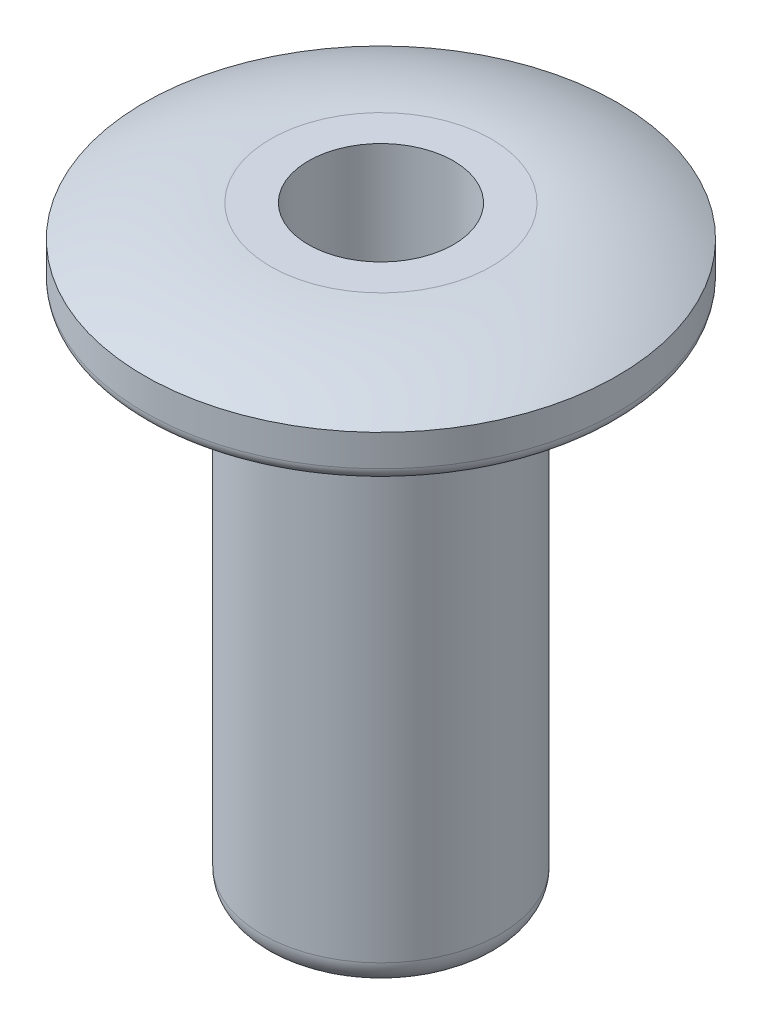
ISO-10303-21;
HEADER;
FILE_DESCRIPTION(('STEP AP214'),'2;1');
FILE_NAME('part.step','',(''),(''),'','','');
FILE_SCHEMA(('AUTOMOTIVE_DESIGN { 1 0 10303 214 1 1 1 1 }'));
ENDSEC;
DATA;
#1=APPLICATION_CONTEXT('core data for automotive mechanical design processes');
#2=APPLICATION_PROTOCOL_DEFINITION('international standard','automotive_design',2000,#1);
#3=PRODUCT_CONTEXT('',#1,'mechanical');
#4=PRODUCT('Part','Part','',(#3));
#5=PRODUCT_RELATED_PRODUCT_CATEGORY('part','',(#4));
#6=PRODUCT_DEFINITION_FORMATION('','',#4);
#7=PRODUCT_DEFINITION_CONTEXT('part definition',#1,'design');
#8=PRODUCT_DEFINITION('design','',#6,#7);
#9=PRODUCT_DEFINITION_SHAPE('','',#8);
#10=(LENGTH_UNIT() NAMED_UNIT(*) SI_UNIT(.MILLI.,.METRE.));
#11=(NAMED_UNIT(*) PLANE_ANGLE_UNIT() SI_UNIT($,.RADIAN.));
#12=(NAMED_UNIT(*) SI_UNIT($,.STERADIAN.) SOLID_ANGLE_UNIT());
#13=UNCERTAINTY_MEASURE_WITH_UNIT(LENGTH_MEASURE(1.E-05),#10,'distance_accuracy_value','');
#14=(GEOMETRIC_REPRESENTATION_CONTEXT(3) GLOBAL_UNCERTAINTY_ASSIGNED_CONTEXT((#13)) GLOBAL_UNIT_ASSIGNED_CONTEXT((#10,
#11,#12)) REPRESENTATION_CONTEXT('',''));
#15=CARTESIAN_POINT('',(0.,0.,0.));
#16=DIRECTION('',(0.,0.,1.));
#17=DIRECTION('',(1.,0.,0.));
#18=AXIS2_PLACEMENT_3D('',#15,#16,#17);
#19=CARTESIAN_POINT('',(0.,6.66749999999997,-2.2225));
#20=DIRECTION('',(1.,0.,0.));
#21=DIRECTION('',(0.,0.,-1.));
#22=AXIS2_PLACEMENT_3D('',#19,#20,#21);
#23=CIRCLE('',#22,5.39750000000002);
#24=TRIMMED_CURVE('',#23,(PARAMETER_VALUE(-1.99518603538808)),
(PARAMETER_VALUE(1.99518603538808)),.T.,.PARAMETER.);
#25=CARTESIAN_POINT('',(0.,6.66749999999997,0.));
#26=DIRECTION('',(0.,-1.,0.));
#27=AXIS1_PLACEMENT('',#25,#26);
#28=SURFACE_OF_REVOLUTION('',#24,#27);
#29=CARTESIAN_POINT('',(0.,11.43,0.));
#30=DIRECTION('',(0.,-1.,0.));
#31=DIRECTION('',(0.,0.,-1.));
#32=AXIS2_PLACEMENT_3D('',#29,#30,#31);
#33=CIRCLE('',#32,4.7625);
#34=CARTESIAN_POINT('',(0.,11.43,-4.7625));
#35=VERTEX_POINT('',#34);
#36=EDGE_CURVE('E58',#35,#35,#33,.T.);
#37=ORIENTED_EDGE('',*,*,#36,.F.);
#38=EDGE_LOOP('',(#37));
#39=FACE_BOUND('',#38,.T.);
#40=CARTESIAN_POINT('',(0.,12.065,0.));
#41=DIRECTION('',(0.,-1.,0.));
#42=DIRECTION('',(0.,0.,-1.));
#43=AXIS2_PLACEMENT_3D('',#40,#41,#42);
#44=CIRCLE('',#43,2.2225);
#45=CARTESIAN_POINT('',(0.,12.065,-2.2225));
#46=VERTEX_POINT('',#45);
#47=CARTESIAN_POINT('',(0.,12.065,2.2225));
#48=VERTEX_POINT('',#47);
#49=EDGE_CURVE('E54',#46,#48,#44,.T.);
#50=ORIENTED_EDGE('',*,*,#49,.T.);
#51=CARTESIAN_POINT('',(0.,12.065,0.));
#52=DIRECTION('',(0.,-1.,0.));
#53=DIRECTION('',(0.,0.,1.));
#54=AXIS2_PLACEMENT_3D('',#51,#52,#53);
#55=CIRCLE('',#54,2.2225);
#56=EDGE_CURVE('E52',#48,#46,#55,.T.);
#57=ORIENTED_EDGE('',*,*,#56,.T.);
#58=EDGE_LOOP('',(#50,#57));
#59=FACE_BOUND('',#58,.T.);
#60=ADVANCED_FACE('F17',(#39,#59),#28,.F.);
#61=CARTESIAN_POINT('',(-1.4605,12.065,0.));
#62=DIRECTION('',(0.,-1.,0.));
#63=DIRECTION('',(0.,0.,-1.));
#64=AXIS2_PLACEMENT_3D('',#61,#62,#63);
#65=PLANE('',#64);
#66=CARTESIAN_POINT('',(0.,12.065,0.));
#67=DIRECTION('',(0.,-1.,0.));
#68=DIRECTION('',(0.,0.,-1.));
#69=AXIS2_PLACEMENT_3D('',#66,#67,#68);
#70=CIRCLE('',#69,1.4605);
#71=CARTESIAN_POINT('',(0.,12.065,-1.4605));
#72=VERTEX_POINT('',#71);
#73=EDGE_CURVE('E90',#72,#72,#70,.T.);
#74=ORIENTED_EDGE('',*,*,#73,.T.);
#75=EDGE_LOOP('',(#74));
#76=FACE_BOUND('',#75,.T.);
#77=ORIENTED_EDGE('',*,*,#56,.F.);
#78=ORIENTED_EDGE('',*,*,#49,.F.);
#79=EDGE_LOOP('',(#77,#78));
#80=FACE_BOUND('',#79,.T.);
#81=ADVANCED_FACE('F61',(#76,#80),#65,.F.);
#82=CARTESIAN_POINT('',(0.,0.,0.));
#83=DIRECTION('',(0.,-1.,0.));
#84=DIRECTION('',(0.,0.,-1.));
#85=AXIS2_PLACEMENT_3D('',#82,#83,#84);
#86=CYLINDRICAL_SURFACE('',#85,4.7625);
#87=CARTESIAN_POINT('',(0.,10.795,0.));
#88=DIRECTION('',(0.,-1.,0.));
#89=DIRECTION('',(0.,0.,-1.));
#90=AXIS2_PLACEMENT_3D('',#87,#88,#89);
#91=CIRCLE('',#90,4.7625);
#92=CARTESIAN_POINT('',(0.,10.795,-4.7625));
#93=VERTEX_POINT('',#92);
#94=EDGE_CURVE('E64',#93,#93,#91,.T.);
#95=ORIENTED_EDGE('',*,*,#94,.F.);
#96=EDGE_LOOP('',(#95));
#97=FACE_BOUND('',#96,.T.);
#98=ORIENTED_EDGE('',*,*,#36,.T.);
#99=EDGE_LOOP('',(#98));
#100=FACE_BOUND('',#99,.T.);
#101=ADVANCED_FACE('F77',(#97,#100),#86,.T.);
#102=CARTESIAN_POINT('',(0.,0.,0.));
#103=DIRECTION('',(0.,-1.,0.));
#104=DIRECTION('',(0.,0.,-1.));
#105=AXIS2_PLACEMENT_3D('',#102,#103,#104);
#106=CYLINDRICAL_SURFACE('',#105,1.4605);
#107=ORIENTED_EDGE('',*,*,#73,.F.);
#108=EDGE_LOOP('',(#107));
#109=FACE_BOUND('',#108,.T.);
#110=CARTESIAN_POINT('',(0.,0.,0.));
#111=DIRECTION('',(0.,-1.,0.));
#112=DIRECTION('',(0.,0.,-1.));
#113=AXIS2_PLACEMENT_3D('',#110,#111,#112);
#114=CIRCLE('',#113,1.4605);
#115=CARTESIAN_POINT('',(0.,0.,-1.4605));
#116=VERTEX_POINT('',#115);
#117=EDGE_CURVE('E98',#116,#116,#114,.T.);
#118=ORIENTED_EDGE('',*,*,#117,.T.);
#119=EDGE_LOOP('',(#118));
#120=FACE_BOUND('',#119,.T.);
#121=ADVANCED_FACE('F200',(#109,#120),#106,.F.);
#122=CARTESIAN_POINT('',(0.,10.795,0.));
#123=DIRECTION('',(0.,-1.,0.));
#124=DIRECTION('',(0.,0.,-1.));
#125=AXIS2_PLACEMENT_3D('',#122,#123,#124);
#126=TOROIDAL_SURFACE('',#125,4.5085,0.254000000000002);
#127=CARTESIAN_POINT('',(0.,10.541,0.));
#128=DIRECTION('',(0.,1.,0.));
#129=DIRECTION('',(0.,0.,-1.));
#130=AXIS2_PLACEMENT_3D('',#127,#128,#129);
#131=CIRCLE('',#130,4.5085);
#132=CARTESIAN_POINT('',(0.,10.541,-4.5085));
#133=VERTEX_POINT('',#132);
#134=CARTESIAN_POINT('',(0.,10.541,4.5085));
#135=VERTEX_POINT('',#134);
#136=EDGE_CURVE('E133',#133,#135,#131,.T.);
#137=ORIENTED_EDGE('',*,*,#136,.T.);
#138=CARTESIAN_POINT('',(0.,10.541,0.));
#139=DIRECTION('',(0.,1.,0.));
#140=DIRECTION('',(0.,0.,1.));
#141=AXIS2_PLACEMENT_3D('',#138,#139,#140);
#142=CIRCLE('',#141,4.5085);
#143=EDGE_CURVE('E143',#135,#133,#142,.T.);
#144=ORIENTED_EDGE('',*,*,#143,.T.);
#145=EDGE_LOOP('',(#137,#144));
#146=FACE_BOUND('',#145,.T.);
#147=ORIENTED_EDGE('',*,*,#94,.T.);
#148=EDGE_LOOP('',(#147));
#149=FACE_BOUND('',#148,.T.);
#150=ADVANCED_FACE('F166',(#146,#149),#126,.T.);
#151=CARTESIAN_POINT('',(-2.39395,0.,0.));
#152=DIRECTION('',(0.,1.,0.));
#153=DIRECTION('',(0.,0.,1.));
#154=AXIS2_PLACEMENT_3D('',#151,#152,#153);
#155=PLANE('',#154);
#156=ORIENTED_EDGE('',*,*,#117,.F.);
#157=EDGE_LOOP('',(#156));
#158=FACE_BOUND('',#157,.T.);
#159=CARTESIAN_POINT('',(0.,0.,0.));
#160=DIRECTION('',(0.,1.,0.));
#161=DIRECTION('',(0.,0.,1.));
#162=AXIS2_PLACEMENT_3D('',#159,#160,#161);
#163=CIRCLE('',#162,1.88595);
#164=CARTESIAN_POINT('',(0.,0.,1.88595));
#165=VERTEX_POINT('',#164);
#166=CARTESIAN_POINT('',(0.,0.,-1.88595));
#167=VERTEX_POINT('',#166);
#168=EDGE_CURVE('E153',#165,#167,#163,.T.);
#169=ORIENTED_EDGE('',*,*,#168,.F.);
#170=CARTESIAN_POINT('',(0.,0.,0.));
#171=DIRECTION('',(0.,1.,0.));
#172=DIRECTION('',(0.,0.,-1.));
#173=AXIS2_PLACEMENT_3D('',#170,#171,#172);
#174=CIRCLE('',#173,1.88595);
#175=EDGE_CURVE('E37',#167,#165,#174,.T.);
#176=ORIENTED_EDGE('',*,*,#175,.F.);
#177=EDGE_LOOP('',(#169,#176));
#178=FACE_BOUND('',#177,.T.);
#179=ADVANCED_FACE('F157',(#158,#178),#155,.F.);
#180=CARTESIAN_POINT('',(-4.5085,10.541,0.));
#181=DIRECTION('',(0.,1.,0.));
#182=DIRECTION('',(0.,0.,1.));
#183=AXIS2_PLACEMENT_3D('',#180,#181,#182);
#184=PLANE('',#183);
#185=ORIENTED_EDGE('',*,*,#136,.F.);
#186=ORIENTED_EDGE('',*,*,#143,.F.);
#187=EDGE_LOOP('',(#185,#186));
#188=FACE_BOUND('',#187,.T.);
#189=CARTESIAN_POINT('',(0.,10.541,0.));
#190=DIRECTION('',(0.,-1.,0.));
#191=DIRECTION('',(0.,0.,-1.));
#192=AXIS2_PLACEMENT_3D('',#189,#190,#191);
#193=CIRCLE('',#192,2.39395);
#194=CARTESIAN_POINT('',(0.,10.541,-2.39395));
#195=VERTEX_POINT('',#194);
#196=EDGE_CURVE('E29',#195,#195,#193,.T.);
#197=ORIENTED_EDGE('',*,*,#196,.F.);
#198=EDGE_LOOP('',(#197));
#199=FACE_BOUND('',#198,.T.);
#200=ADVANCED_FACE('F121',(#188,#199),#184,.F.);
#201=CARTESIAN_POINT('',(0.,0.508,0.));
#202=DIRECTION('',(0.,1.,0.));
#203=DIRECTION('',(0.,0.,1.));
#204=AXIS2_PLACEMENT_3D('',#201,#202,#203);
#205=TOROIDAL_SURFACE('',#204,1.88595,0.508);
#206=CARTESIAN_POINT('',(0.,0.508,0.));
#207=DIRECTION('',(0.,-1.,0.));
#208=DIRECTION('',(0.,0.,-1.));
#209=AXIS2_PLACEMENT_3D('',#206,#207,#208);
#210=CIRCLE('',#209,2.39395);
#211=CARTESIAN_POINT('',(0.,0.508,-2.39395));
#212=VERTEX_POINT('',#211);
#213=EDGE_CURVE('E11',#212,#212,#210,.F.);
#214=ORIENTED_EDGE('',*,*,#213,.F.);
#215=EDGE_LOOP('',(#214));
#216=FACE_BOUND('',#215,.T.);
#217=ORIENTED_EDGE('',*,*,#168,.T.);
#218=ORIENTED_EDGE('',*,*,#175,.T.);
#219=EDGE_LOOP('',(#217,#218));
#220=FACE_BOUND('',#219,.T.);
#221=ADVANCED_FACE('F109',(#216,#220),#205,.T.);
#222=CARTESIAN_POINT('',(0.,0.,0.));
#223=DIRECTION('',(0.,-1.,0.));
#224=DIRECTION('',(0.,0.,-1.));
#225=AXIS2_PLACEMENT_3D('',#222,#223,#224);
#226=CYLINDRICAL_SURFACE('',#225,2.39395);
#227=ORIENTED_EDGE('',*,*,#213,.T.);
#228=EDGE_LOOP('',(#227));
#229=FACE_BOUND('',#228,.T.);
#230=ORIENTED_EDGE('',*,*,#196,.T.);
#231=EDGE_LOOP('',(#230));
#232=FACE_BOUND('',#231,.T.);
#233=ADVANCED_FACE('F120',(#229,#232),#226,.T.);
#234=CLOSED_SHELL('',(#60,#81,#101,#121,#150,#179,#200,#221,#233));
#235=MANIFOLD_SOLID_BREP('B1',#234);
#236=ADVANCED_BREP_SHAPE_REPRESENTATION('',(#18,#235),#14);
#237=SHAPE_DEFINITION_REPRESENTATION(#9,#236);
ENDSEC;
END-ISO-10303-21;
